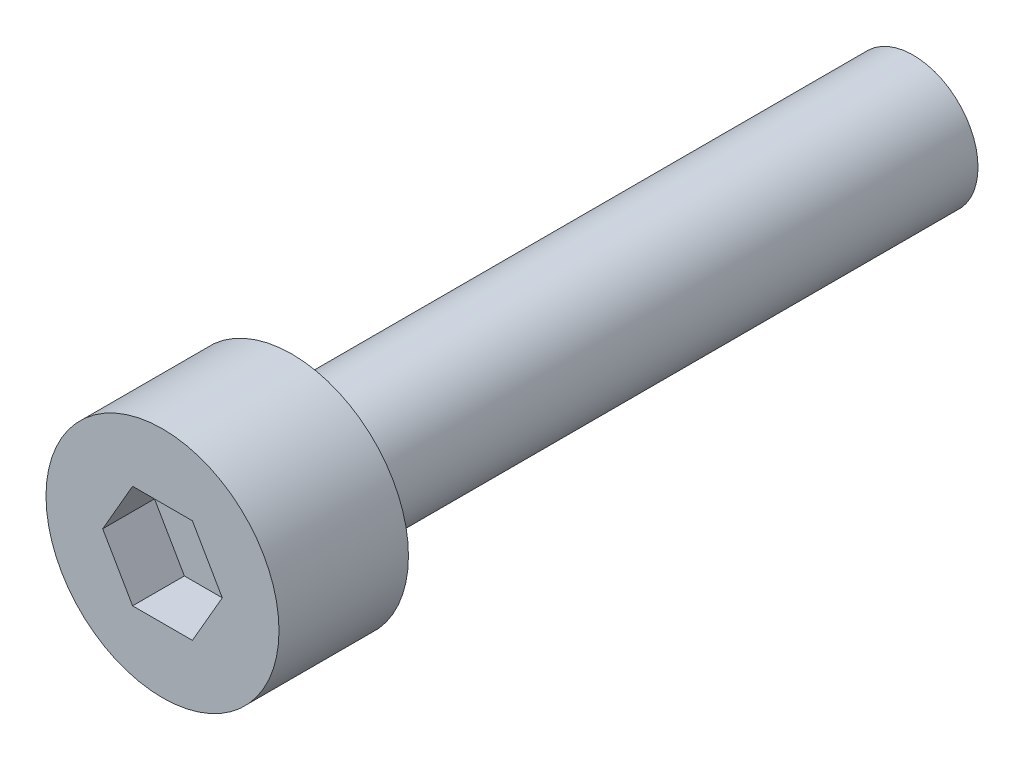
ISO-10303-21;
HEADER;
FILE_DESCRIPTION(('STEP AP214'),'2;1');
FILE_NAME('part.step','',(''),(''),'','','');
FILE_SCHEMA(('AUTOMOTIVE_DESIGN { 1 0 10303 214 1 1 1 1 }'));
ENDSEC;
DATA;
#1=APPLICATION_CONTEXT('core data for automotive mechanical design processes');
#2=APPLICATION_PROTOCOL_DEFINITION('international standard','automotive_design',2000,#1);
#3=PRODUCT_CONTEXT('',#1,'mechanical');
#4=PRODUCT('Part','Part','',(#3));
#5=PRODUCT_RELATED_PRODUCT_CATEGORY('part','',(#4));
#6=PRODUCT_DEFINITION_FORMATION('','',#4);
#7=PRODUCT_DEFINITION_CONTEXT('part definition',#1,'design');
#8=PRODUCT_DEFINITION('design','',#6,#7);
#9=PRODUCT_DEFINITION_SHAPE('','',#8);
#10=(LENGTH_UNIT() NAMED_UNIT(*) SI_UNIT(.MILLI.,.METRE.));
#11=(NAMED_UNIT(*) PLANE_ANGLE_UNIT() SI_UNIT($,.RADIAN.));
#12=(NAMED_UNIT(*) SI_UNIT($,.STERADIAN.) SOLID_ANGLE_UNIT());
#13=UNCERTAINTY_MEASURE_WITH_UNIT(LENGTH_MEASURE(1.E-05),#10,'distance_accuracy_value','');
#14=(GEOMETRIC_REPRESENTATION_CONTEXT(3) GLOBAL_UNCERTAINTY_ASSIGNED_CONTEXT((#13)) GLOBAL_UNIT_ASSIGNED_CONTEXT((#10,
#11,#12)) REPRESENTATION_CONTEXT('',''));
#15=CARTESIAN_POINT('',(0.,0.,0.));
#16=DIRECTION('',(0.,0.,1.));
#17=DIRECTION('',(1.,0.,0.));
#18=AXIS2_PLACEMENT_3D('',#15,#16,#17);
#19=CARTESIAN_POINT('',(0.,0.,-2.5));
#20=DIRECTION('',(0.,0.,1.));
#21=DIRECTION('',(-1.,0.,0.));
#22=AXIS2_PLACEMENT_3D('',#19,#20,#21);
#23=CYLINDRICAL_SURFACE('',#22,2.25);
#24=CARTESIAN_POINT('',(0.,0.,-2.5));
#25=DIRECTION('',(0.,0.,1.));
#26=DIRECTION('',(1.,0.,0.));
#27=AXIS2_PLACEMENT_3D('',#24,#25,#26);
#28=CIRCLE('',#27,2.25);
#29=CARTESIAN_POINT('',(2.25,0.,-2.5));
#30=VERTEX_POINT('',#29);
#31=EDGE_CURVE('E11',#30,#30,#28,.T.);
#32=ORIENTED_EDGE('',*,*,#31,.T.);
#33=EDGE_LOOP('',(#32));
#34=FACE_BOUND('',#33,.T.);
#35=CARTESIAN_POINT('',(0.,0.,0.));
#36=DIRECTION('',(0.,0.,1.));
#37=DIRECTION('',(1.,0.,0.));
#38=AXIS2_PLACEMENT_3D('',#35,#36,#37);
#39=CIRCLE('',#38,2.25);
#40=CARTESIAN_POINT('',(2.25,0.,0.));
#41=VERTEX_POINT('',#40);
#42=EDGE_CURVE('E42',#41,#41,#39,.T.);
#43=ORIENTED_EDGE('',*,*,#42,.F.);
#44=EDGE_LOOP('',(#43));
#45=FACE_BOUND('',#44,.T.);
#46=ADVANCED_FACE('F39',(#34,#45),#23,.T.);
#47=CARTESIAN_POINT('',(0.,0.,-2.5));
#48=DIRECTION('',(0.,0.,-1.));
#49=DIRECTION('',(1.,0.,0.));
#50=AXIS2_PLACEMENT_3D('',#47,#48,#49);
#51=PLANE('',#50);
#52=CARTESIAN_POINT('',(0.,0.,-2.5));
#53=DIRECTION('',(0.,0.,1.));
#54=DIRECTION('',(1.,0.,0.));
#55=AXIS2_PLACEMENT_3D('',#52,#53,#54);
#56=CIRCLE('',#55,1.25);
#57=CARTESIAN_POINT('',(1.25,0.,-2.5));
#58=VERTEX_POINT('',#57);
#59=EDGE_CURVE('E130',#58,#58,#56,.T.);
#60=ORIENTED_EDGE('',*,*,#59,.T.);
#61=EDGE_LOOP('',(#60));
#62=FACE_BOUND('',#61,.T.);
#63=ORIENTED_EDGE('',*,*,#31,.F.);
#64=EDGE_LOOP('',(#63));
#65=FACE_BOUND('',#64,.T.);
#66=ADVANCED_FACE('F170',(#62,#65),#51,.T.);
#67=CARTESIAN_POINT('',(0.,0.,0.));
#68=DIRECTION('',(0.,0.,-1.));
#69=DIRECTION('',(1.,0.,0.));
#70=AXIS2_PLACEMENT_3D('',#67,#68,#69);
#71=PLANE('',#70);
#72=DIRECTION('',(0.5,0.866025403784438,0.));
#73=VECTOR('',#72,1.);
#74=CARTESIAN_POINT('',(-1.15470053837925,0.,0.));
#75=LINE('',#74,#73);
#76=CARTESIAN_POINT('',(-1.15470053837925,0.,0.));
#77=VERTEX_POINT('',#76);
#78=CARTESIAN_POINT('',(-0.577350269189626,1.,0.));
#79=VERTEX_POINT('',#78);
#80=EDGE_CURVE('E145',#77,#79,#75,.T.);
#81=ORIENTED_EDGE('',*,*,#80,.T.);
#82=DIRECTION('',(1.,0.,0.));
#83=VECTOR('',#82,1.);
#84=CARTESIAN_POINT('',(-0.577350269189626,1.,0.));
#85=LINE('',#84,#83);
#86=CARTESIAN_POINT('',(0.577350269189626,1.,0.));
#87=VERTEX_POINT('',#86);
#88=EDGE_CURVE('E142',#79,#87,#85,.T.);
#89=ORIENTED_EDGE('',*,*,#88,.T.);
#90=DIRECTION('',(0.5,-0.866025403784439,0.));
#91=VECTOR('',#90,1.);
#92=CARTESIAN_POINT('',(0.577350269189626,1.,0.));
#93=LINE('',#92,#91);
#94=CARTESIAN_POINT('',(1.15470053837925,0.,0.));
#95=VERTEX_POINT('',#94);
#96=EDGE_CURVE('E140',#87,#95,#93,.T.);
#97=ORIENTED_EDGE('',*,*,#96,.T.);
#98=DIRECTION('',(-0.5,-0.866025403784438,0.));
#99=VECTOR('',#98,1.);
#100=CARTESIAN_POINT('',(1.15470053837925,0.,0.));
#101=LINE('',#100,#99);
#102=CARTESIAN_POINT('',(0.577350269189626,-1.,0.));
#103=VERTEX_POINT('',#102);
#104=EDGE_CURVE('E116',#95,#103,#101,.T.);
#105=ORIENTED_EDGE('',*,*,#104,.T.);
#106=DIRECTION('',(-1.,0.,0.));
#107=VECTOR('',#106,1.);
#108=CARTESIAN_POINT('',(0.577350269189626,-1.,0.));
#109=LINE('',#108,#107);
#110=CARTESIAN_POINT('',(-0.577350269189626,-1.,0.));
#111=VERTEX_POINT('',#110);
#112=EDGE_CURVE('E135',#103,#111,#109,.T.);
#113=ORIENTED_EDGE('',*,*,#112,.T.);
#114=DIRECTION('',(-0.5,0.866025403784439,0.));
#115=VECTOR('',#114,1.);
#116=CARTESIAN_POINT('',(-0.577350269189626,-1.,0.));
#117=LINE('',#116,#115);
#118=EDGE_CURVE('E148',#111,#77,#117,.T.);
#119=ORIENTED_EDGE('',*,*,#118,.T.);
#120=EDGE_LOOP('',(#81,#89,#97,#105,#113,#119));
#121=FACE_BOUND('',#120,.T.);
#122=ORIENTED_EDGE('',*,*,#42,.T.);
#123=EDGE_LOOP('',(#122));
#124=FACE_BOUND('',#123,.T.);
#125=ADVANCED_FACE('F156',(#121,#124),#71,.F.);
#126=CARTESIAN_POINT('',(0.,0.,-14.5));
#127=DIRECTION('',(0.,0.,1.));
#128=DIRECTION('',(-1.,0.,0.));
#129=AXIS2_PLACEMENT_3D('',#126,#127,#128);
#130=CYLINDRICAL_SURFACE('',#129,1.25);
#131=CARTESIAN_POINT('',(0.,0.,-14.5));
#132=DIRECTION('',(0.,0.,1.));
#133=DIRECTION('',(1.,0.,0.));
#134=AXIS2_PLACEMENT_3D('',#131,#132,#133);
#135=CIRCLE('',#134,1.25);
#136=CARTESIAN_POINT('',(1.25,0.,-14.5));
#137=VERTEX_POINT('',#136);
#138=EDGE_CURVE('E127',#137,#137,#135,.T.);
#139=ORIENTED_EDGE('',*,*,#138,.T.);
#140=EDGE_LOOP('',(#139));
#141=FACE_BOUND('',#140,.T.);
#142=ORIENTED_EDGE('',*,*,#59,.F.);
#143=EDGE_LOOP('',(#142));
#144=FACE_BOUND('',#143,.T.);
#145=ADVANCED_FACE('F181',(#141,#144),#130,.T.);
#146=CARTESIAN_POINT('',(0.,0.,-14.5));
#147=DIRECTION('',(0.,0.,-1.));
#148=DIRECTION('',(1.,0.,0.));
#149=AXIS2_PLACEMENT_3D('',#146,#147,#148);
#150=PLANE('',#149);
#151=ORIENTED_EDGE('',*,*,#138,.F.);
#152=EDGE_LOOP('',(#151));
#153=FACE_BOUND('',#152,.T.);
#154=ADVANCED_FACE('F166',(#153),#150,.T.);
#155=CARTESIAN_POINT('',(-0.577350269189626,-1.,-1.));
#156=DIRECTION('',(-0.866025403784439,-0.5,0.));
#157=DIRECTION('',(0.5,-0.866025403784439,0.));
#158=AXIS2_PLACEMENT_3D('',#155,#156,#157);
#159=PLANE('',#158);
#160=ORIENTED_EDGE('',*,*,#118,.F.);
#161=DIRECTION('',(0.,0.,1.));
#162=VECTOR('',#161,1.);
#163=CARTESIAN_POINT('',(-0.577350269189626,-1.,-1.));
#164=LINE('',#163,#162);
#165=CARTESIAN_POINT('',(-0.577350269189626,-1.,-1.));
#166=VERTEX_POINT('',#165);
#167=EDGE_CURVE('E84',#166,#111,#164,.T.);
#168=ORIENTED_EDGE('',*,*,#167,.F.);
#169=DIRECTION('',(-0.5,0.866025403784439,0.));
#170=VECTOR('',#169,1.);
#171=CARTESIAN_POINT('',(-0.577350269189626,-1.,-1.));
#172=LINE('',#171,#170);
#173=CARTESIAN_POINT('',(-1.15470053837925,0.,-1.));
#174=VERTEX_POINT('',#173);
#175=EDGE_CURVE('E138',#166,#174,#172,.T.);
#176=ORIENTED_EDGE('',*,*,#175,.T.);
#177=DIRECTION('',(0.,0.,1.));
#178=VECTOR('',#177,1.);
#179=CARTESIAN_POINT('',(-1.15470053837925,0.,-1.));
#180=LINE('',#179,#178);
#181=EDGE_CURVE('E53',#174,#77,#180,.T.);
#182=ORIENTED_EDGE('',*,*,#181,.T.);
#183=EDGE_LOOP('',(#160,#168,#176,#182));
#184=FACE_BOUND('',#183,.T.);
#185=ADVANCED_FACE('F153',(#184),#159,.F.);
#186=CARTESIAN_POINT('',(0.577350269189626,-1.,-1.));
#187=DIRECTION('',(0.,-1.,0.));
#188=DIRECTION('',(0.,0.,1.));
#189=AXIS2_PLACEMENT_3D('',#186,#187,#188);
#190=PLANE('',#189);
#191=ORIENTED_EDGE('',*,*,#112,.F.);
#192=DIRECTION('',(0.,0.,1.));
#193=VECTOR('',#192,1.);
#194=CARTESIAN_POINT('',(0.577350269189626,-1.,-1.));
#195=LINE('',#194,#193);
#196=CARTESIAN_POINT('',(0.577350269189626,-1.,-1.));
#197=VERTEX_POINT('',#196);
#198=EDGE_CURVE('E118',#197,#103,#195,.T.);
#199=ORIENTED_EDGE('',*,*,#198,.F.);
#200=DIRECTION('',(-1.,0.,0.));
#201=VECTOR('',#200,1.);
#202=CARTESIAN_POINT('',(0.577350269189626,-1.,-1.));
#203=LINE('',#202,#201);
#204=EDGE_CURVE('E62',#197,#166,#203,.T.);
#205=ORIENTED_EDGE('',*,*,#204,.T.);
#206=ORIENTED_EDGE('',*,*,#167,.T.);
#207=EDGE_LOOP('',(#191,#199,#205,#206));
#208=FACE_BOUND('',#207,.T.);
#209=ADVANCED_FACE('F158',(#208),#190,.F.);
#210=CARTESIAN_POINT('',(1.15470053837925,0.,-1.));
#211=DIRECTION('',(0.866025403784439,-0.5,0.));
#212=DIRECTION('',(0.5,0.866025403784439,0.));
#213=AXIS2_PLACEMENT_3D('',#210,#211,#212);
#214=PLANE('',#213);
#215=ORIENTED_EDGE('',*,*,#104,.F.);
#216=DIRECTION('',(0.,0.,1.));
#217=VECTOR('',#216,1.);
#218=CARTESIAN_POINT('',(1.15470053837925,0.,-1.));
#219=LINE('',#218,#217);
#220=CARTESIAN_POINT('',(1.15470053837925,0.,-1.));
#221=VERTEX_POINT('',#220);
#222=EDGE_CURVE('E105',#221,#95,#219,.T.);
#223=ORIENTED_EDGE('',*,*,#222,.F.);
#224=DIRECTION('',(-0.5,-0.866025403784438,0.));
#225=VECTOR('',#224,1.);
#226=CARTESIAN_POINT('',(1.15470053837925,0.,-1.));
#227=LINE('',#226,#225);
#228=EDGE_CURVE('E108',#221,#197,#227,.T.);
#229=ORIENTED_EDGE('',*,*,#228,.T.);
#230=ORIENTED_EDGE('',*,*,#198,.T.);
#231=EDGE_LOOP('',(#215,#223,#229,#230));
#232=FACE_BOUND('',#231,.T.);
#233=ADVANCED_FACE('F114',(#232),#214,.F.);
#234=CARTESIAN_POINT('',(0.577350269189626,1.,-1.));
#235=DIRECTION('',(0.866025403784439,0.5,0.));
#236=DIRECTION('',(-0.5,0.866025403784439,0.));
#237=AXIS2_PLACEMENT_3D('',#234,#235,#236);
#238=PLANE('',#237);
#239=ORIENTED_EDGE('',*,*,#96,.F.);
#240=DIRECTION('',(0.,0.,1.));
#241=VECTOR('',#240,1.);
#242=CARTESIAN_POINT('',(0.577350269189626,1.,-1.));
#243=LINE('',#242,#241);
#244=CARTESIAN_POINT('',(0.577350269189626,1.,-1.));
#245=VERTEX_POINT('',#244);
#246=EDGE_CURVE('E107',#245,#87,#243,.T.);
#247=ORIENTED_EDGE('',*,*,#246,.F.);
#248=DIRECTION('',(0.5,-0.866025403784439,0.));
#249=VECTOR('',#248,1.);
#250=CARTESIAN_POINT('',(0.577350269189626,1.,-1.));
#251=LINE('',#250,#249);
#252=EDGE_CURVE('E100',#245,#221,#251,.T.);
#253=ORIENTED_EDGE('',*,*,#252,.T.);
#254=ORIENTED_EDGE('',*,*,#222,.T.);
#255=EDGE_LOOP('',(#239,#247,#253,#254));
#256=FACE_BOUND('',#255,.T.);
#257=ADVANCED_FACE('F103',(#256),#238,.F.);
#258=CARTESIAN_POINT('',(-0.577350269189626,1.,-1.));
#259=DIRECTION('',(0.,1.,0.));
#260=DIRECTION('',(0.,0.,-1.));
#261=AXIS2_PLACEMENT_3D('',#258,#259,#260);
#262=PLANE('',#261);
#263=ORIENTED_EDGE('',*,*,#88,.F.);
#264=DIRECTION('',(0.,0.,1.));
#265=VECTOR('',#264,1.);
#266=CARTESIAN_POINT('',(-0.577350269189626,1.,-1.));
#267=LINE('',#266,#265);
#268=CARTESIAN_POINT('',(-0.577350269189626,1.,-1.));
#269=VERTEX_POINT('',#268);
#270=EDGE_CURVE('E121',#269,#79,#267,.T.);
#271=ORIENTED_EDGE('',*,*,#270,.F.);
#272=DIRECTION('',(1.,0.,0.));
#273=VECTOR('',#272,1.);
#274=CARTESIAN_POINT('',(-0.577350269189626,1.,-1.));
#275=LINE('',#274,#273);
#276=EDGE_CURVE('E109',#269,#245,#275,.T.);
#277=ORIENTED_EDGE('',*,*,#276,.T.);
#278=ORIENTED_EDGE('',*,*,#246,.T.);
#279=EDGE_LOOP('',(#263,#271,#277,#278));
#280=FACE_BOUND('',#279,.T.);
#281=ADVANCED_FACE('F194',(#280),#262,.F.);
#282=CARTESIAN_POINT('',(-1.15470053837925,0.,-1.));
#283=DIRECTION('',(-0.866025403784438,0.5,0.));
#284=DIRECTION('',(-0.5,-0.866025403784439,0.));
#285=AXIS2_PLACEMENT_3D('',#282,#283,#284);
#286=PLANE('',#285);
#287=ORIENTED_EDGE('',*,*,#80,.F.);
#288=ORIENTED_EDGE('',*,*,#181,.F.);
#289=DIRECTION('',(0.5,0.866025403784438,0.));
#290=VECTOR('',#289,1.);
#291=CARTESIAN_POINT('',(-1.15470053837925,0.,-1.));
#292=LINE('',#291,#290);
#293=EDGE_CURVE('E91',#174,#269,#292,.T.);
#294=ORIENTED_EDGE('',*,*,#293,.T.);
#295=ORIENTED_EDGE('',*,*,#270,.T.);
#296=EDGE_LOOP('',(#287,#288,#294,#295));
#297=FACE_BOUND('',#296,.T.);
#298=ADVANCED_FACE('F191',(#297),#286,.F.);
#299=CARTESIAN_POINT('',(0.,0.,-1.));
#300=DIRECTION('',(0.,0.,1.));
#301=DIRECTION('',(-1.,0.,0.));
#302=AXIS2_PLACEMENT_3D('',#299,#300,#301);
#303=PLANE('',#302);
#304=ORIENTED_EDGE('',*,*,#175,.F.);
#305=ORIENTED_EDGE('',*,*,#204,.F.);
#306=ORIENTED_EDGE('',*,*,#228,.F.);
#307=ORIENTED_EDGE('',*,*,#252,.F.);
#308=ORIENTED_EDGE('',*,*,#276,.F.);
#309=ORIENTED_EDGE('',*,*,#293,.F.);
#310=EDGE_LOOP('',(#304,#305,#306,#307,#308,#309));
#311=FACE_BOUND('',#310,.T.);
#312=ADVANCED_FACE('F111',(#311),#303,.T.);
#313=CLOSED_SHELL('',(#46,#66,#125,#145,#154,#185,#209,#233,#257,#281,#298,#312));
#314=MANIFOLD_SOLID_BREP('B2',#313);
#315=ADVANCED_BREP_SHAPE_REPRESENTATION('',(#18,#314),#14);
#316=SHAPE_DEFINITION_REPRESENTATION(#9,#315);
ENDSEC;
END-ISO-10303-21;
